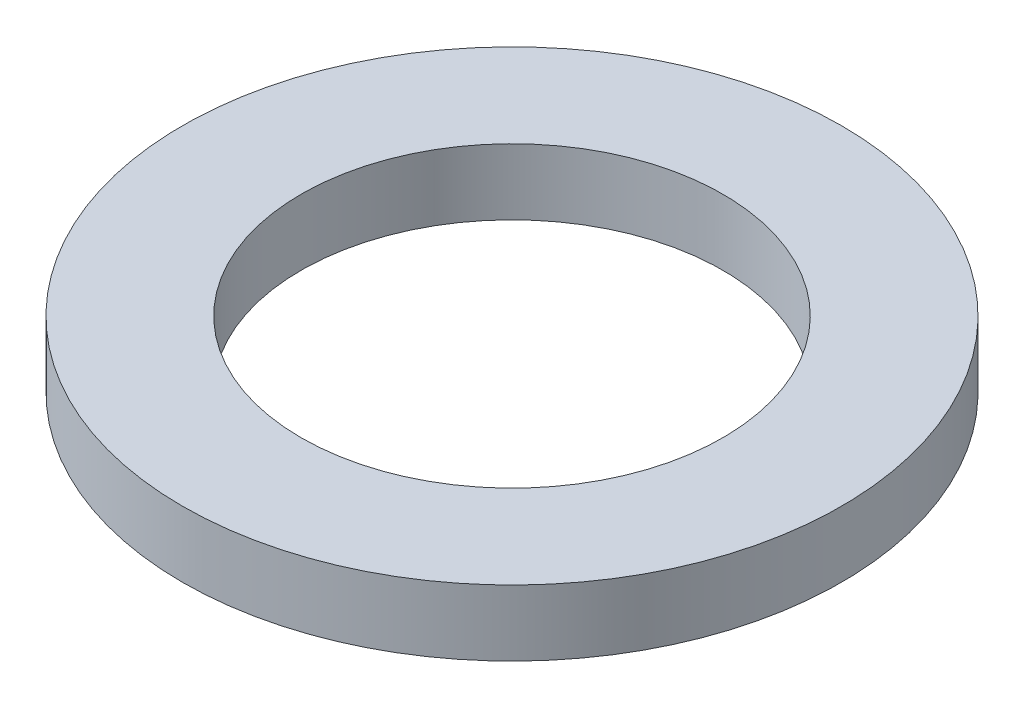
ISO-10303-21;
HEADER;
FILE_DESCRIPTION(('STEP AP214'),'2;1');
FILE_NAME('part.step','',(''),(''),'','','');
FILE_SCHEMA(('AUTOMOTIVE_DESIGN { 1 0 10303 214 1 1 1 1 }'));
ENDSEC;
DATA;
#1=APPLICATION_CONTEXT('core data for automotive mechanical design processes');
#2=APPLICATION_PROTOCOL_DEFINITION('international standard','automotive_design',2000,#1);
#3=PRODUCT_CONTEXT('',#1,'mechanical');
#4=PRODUCT('Part','Part','',(#3));
#5=PRODUCT_RELATED_PRODUCT_CATEGORY('part','',(#4));
#6=PRODUCT_DEFINITION_FORMATION('','',#4);
#7=PRODUCT_DEFINITION_CONTEXT('part definition',#1,'design');
#8=PRODUCT_DEFINITION('design','',#6,#7);
#9=PRODUCT_DEFINITION_SHAPE('','',#8);
#10=(LENGTH_UNIT() NAMED_UNIT(*) SI_UNIT(.MILLI.,.METRE.));
#11=(NAMED_UNIT(*) PLANE_ANGLE_UNIT() SI_UNIT($,.RADIAN.));
#12=(NAMED_UNIT(*) SI_UNIT($,.STERADIAN.) SOLID_ANGLE_UNIT());
#13=UNCERTAINTY_MEASURE_WITH_UNIT(LENGTH_MEASURE(1.E-05),#10,'distance_accuracy_value','');
#14=(GEOMETRIC_REPRESENTATION_CONTEXT(3) GLOBAL_UNCERTAINTY_ASSIGNED_CONTEXT((#13)) GLOBAL_UNIT_ASSIGNED_CONTEXT((#10,
#11,#12)) REPRESENTATION_CONTEXT('',''));
#15=CARTESIAN_POINT('',(0.,0.,0.));
#16=DIRECTION('',(0.,0.,1.));
#17=DIRECTION('',(1.,0.,0.));
#18=AXIS2_PLACEMENT_3D('',#15,#16,#17);
#19=CARTESIAN_POINT('',(0.,0.5,0.));
#20=DIRECTION('',(0.,1.,0.));
#21=DIRECTION('',(0.,0.,1.));
#22=AXIS2_PLACEMENT_3D('',#19,#20,#21);
#23=PLANE('',#22);
#24=CARTESIAN_POINT('',(0.,0.5,0.));
#25=DIRECTION('',(0.,1.,0.));
#26=DIRECTION('',(0.,0.,1.));
#27=AXIS2_PLACEMENT_3D('',#24,#25,#26);
#28=CIRCLE('',#27,2.5);
#29=CARTESIAN_POINT('',(0.,0.5,2.5));
#30=VERTEX_POINT('',#29);
#31=EDGE_CURVE('E10',#30,#30,#28,.T.);
#32=ORIENTED_EDGE('',*,*,#31,.T.);
#33=EDGE_LOOP('',(#32));
#34=FACE_BOUND('',#33,.T.);
#35=CARTESIAN_POINT('',(0.,0.5,0.));
#36=DIRECTION('',(0.,1.,0.));
#37=DIRECTION('',(0.,0.,1.));
#38=AXIS2_PLACEMENT_3D('',#35,#36,#37);
#39=CIRCLE('',#38,1.6);
#40=CARTESIAN_POINT('',(0.,0.5,1.6));
#41=VERTEX_POINT('',#40);
#42=EDGE_CURVE('E41',#41,#41,#39,.T.);
#43=ORIENTED_EDGE('',*,*,#42,.F.);
#44=EDGE_LOOP('',(#43));
#45=FACE_BOUND('',#44,.T.);
#46=ADVANCED_FACE('F30',(#34,#45),#23,.T.);
#47=CARTESIAN_POINT('',(0.,0.,0.));
#48=DIRECTION('',(0.,1.,0.));
#49=DIRECTION('',(0.,0.,1.));
#50=AXIS2_PLACEMENT_3D('',#47,#48,#49);
#51=PLANE('',#50);
#52=CARTESIAN_POINT('',(0.,0.,0.));
#53=DIRECTION('',(0.,1.,0.));
#54=DIRECTION('',(0.,0.,1.));
#55=AXIS2_PLACEMENT_3D('',#52,#53,#54);
#56=CIRCLE('',#55,2.5);
#57=CARTESIAN_POINT('',(0.,0.,2.5));
#58=VERTEX_POINT('',#57);
#59=EDGE_CURVE('E34',#58,#58,#56,.T.);
#60=ORIENTED_EDGE('',*,*,#59,.F.);
#61=EDGE_LOOP('',(#60));
#62=FACE_BOUND('',#61,.T.);
#63=CARTESIAN_POINT('',(0.,0.,0.));
#64=DIRECTION('',(0.,1.,0.));
#65=DIRECTION('',(0.,0.,1.));
#66=AXIS2_PLACEMENT_3D('',#63,#64,#65);
#67=CIRCLE('',#66,1.6);
#68=CARTESIAN_POINT('',(0.,0.,1.6));
#69=VERTEX_POINT('',#68);
#70=EDGE_CURVE('E43',#69,#69,#67,.T.);
#71=ORIENTED_EDGE('',*,*,#70,.T.);
#72=EDGE_LOOP('',(#71));
#73=FACE_BOUND('',#72,.T.);
#74=ADVANCED_FACE('F53',(#62,#73),#51,.F.);
#75=CARTESIAN_POINT('',(0.,0.5,0.));
#76=DIRECTION('',(0.,-1.,0.));
#77=DIRECTION('',(0.,0.,-1.));
#78=AXIS2_PLACEMENT_3D('',#75,#76,#77);
#79=CYLINDRICAL_SURFACE('',#78,2.5);
#80=ORIENTED_EDGE('',*,*,#31,.F.);
#81=EDGE_LOOP('',(#80));
#82=FACE_BOUND('',#81,.T.);
#83=ORIENTED_EDGE('',*,*,#59,.T.);
#84=EDGE_LOOP('',(#83));
#85=FACE_BOUND('',#84,.T.);
#86=ADVANCED_FACE('F32',(#82,#85),#79,.T.);
#87=CARTESIAN_POINT('',(0.,0.5,0.));
#88=DIRECTION('',(0.,-1.,0.));
#89=DIRECTION('',(0.,0.,-1.));
#90=AXIS2_PLACEMENT_3D('',#87,#88,#89);
#91=CYLINDRICAL_SURFACE('',#90,1.6);
#92=ORIENTED_EDGE('',*,*,#42,.T.);
#93=EDGE_LOOP('',(#92));
#94=FACE_BOUND('',#93,.T.);
#95=ORIENTED_EDGE('',*,*,#70,.F.);
#96=EDGE_LOOP('',(#95));
#97=FACE_BOUND('',#96,.T.);
#98=ADVANCED_FACE('F49',(#94,#97),#91,.F.);
#99=CLOSED_SHELL('',(#46,#74,#86,#98));
#100=MANIFOLD_SOLID_BREP('B2',#99);
#101=ADVANCED_BREP_SHAPE_REPRESENTATION('',(#18,#100),#14);
#102=SHAPE_DEFINITION_REPRESENTATION(#9,#101);
ENDSEC;
END-ISO-10303-21;
